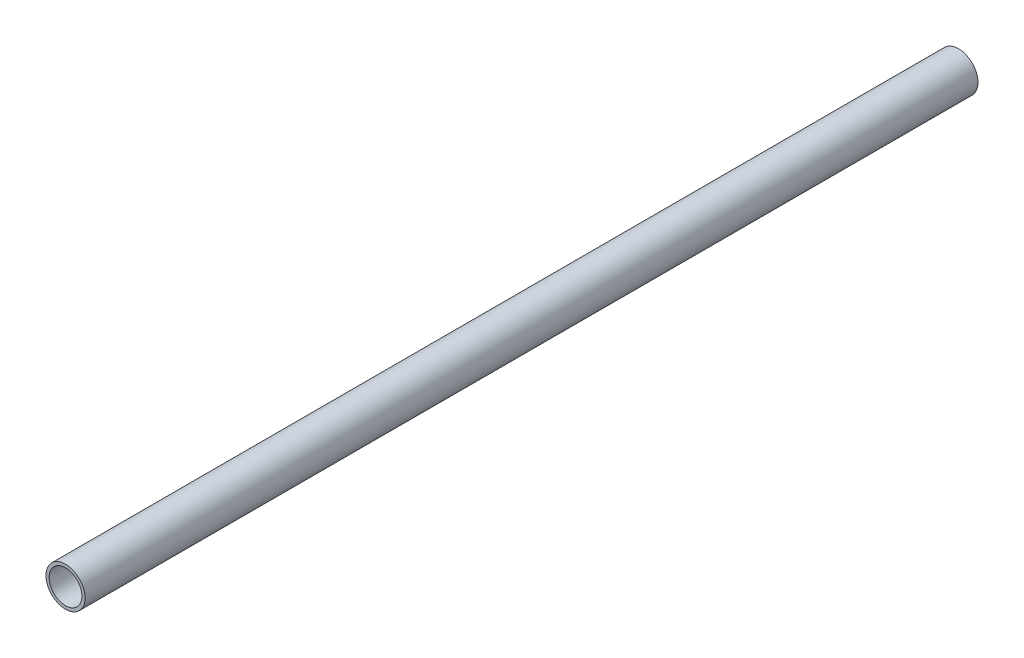
ISO-10303-21;
HEADER;
FILE_DESCRIPTION(('STEP AP214'),'2;1');
FILE_NAME('part.step','',(''),(''),'','','');
FILE_SCHEMA(('AUTOMOTIVE_DESIGN { 1 0 10303 214 1 1 1 1 }'));
ENDSEC;
DATA;
#1=APPLICATION_CONTEXT('core data for automotive mechanical design processes');
#2=APPLICATION_PROTOCOL_DEFINITION('international standard','automotive_design',2000,#1);
#3=PRODUCT_CONTEXT('',#1,'mechanical');
#4=PRODUCT('Part','Part','',(#3));
#5=PRODUCT_RELATED_PRODUCT_CATEGORY('part','',(#4));
#6=PRODUCT_DEFINITION_FORMATION('','',#4);
#7=PRODUCT_DEFINITION_CONTEXT('part definition',#1,'design');
#8=PRODUCT_DEFINITION('design','',#6,#7);
#9=PRODUCT_DEFINITION_SHAPE('','',#8);
#10=(LENGTH_UNIT() NAMED_UNIT(*) SI_UNIT(.MILLI.,.METRE.));
#11=(NAMED_UNIT(*) PLANE_ANGLE_UNIT() SI_UNIT($,.RADIAN.));
#12=(NAMED_UNIT(*) SI_UNIT($,.STERADIAN.) SOLID_ANGLE_UNIT());
#13=UNCERTAINTY_MEASURE_WITH_UNIT(LENGTH_MEASURE(1.E-05),#10,'distance_accuracy_value','');
#14=(GEOMETRIC_REPRESENTATION_CONTEXT(3) GLOBAL_UNCERTAINTY_ASSIGNED_CONTEXT((#13)) GLOBAL_UNIT_ASSIGNED_CONTEXT((#10,
#11,#12)) REPRESENTATION_CONTEXT('',''));
#15=CARTESIAN_POINT('',(0.,0.,0.));
#16=DIRECTION('',(0.,0.,1.));
#17=DIRECTION('',(1.,0.,0.));
#18=AXIS2_PLACEMENT_3D('',#15,#16,#17);
#19=CARTESIAN_POINT('',(0.,0.,571.));
#20=DIRECTION('',(0.,0.,1.));
#21=DIRECTION('',(1.,0.,0.));
#22=AXIS2_PLACEMENT_3D('',#19,#20,#21);
#23=PLANE('',#22);
#24=CARTESIAN_POINT('',(0.,0.,571.));
#25=DIRECTION('',(0.,0.,1.));
#26=DIRECTION('',(1.,0.,0.));
#27=AXIS2_PLACEMENT_3D('',#24,#25,#26);
#28=CIRCLE('',#27,12.5);
#29=CARTESIAN_POINT('',(12.5,0.,571.));
#30=VERTEX_POINT('',#29);
#31=EDGE_CURVE('E10',#30,#30,#28,.T.);
#32=ORIENTED_EDGE('',*,*,#31,.T.);
#33=EDGE_LOOP('',(#32));
#34=FACE_BOUND('',#33,.T.);
#35=CARTESIAN_POINT('',(0.,0.,571.));
#36=DIRECTION('',(0.,0.,1.));
#37=DIRECTION('',(1.,0.,0.));
#38=AXIS2_PLACEMENT_3D('',#35,#36,#37);
#39=CIRCLE('',#38,10.5);
#40=CARTESIAN_POINT('',(10.5,0.,571.));
#41=VERTEX_POINT('',#40);
#42=EDGE_CURVE('E42',#41,#41,#39,.T.);
#43=ORIENTED_EDGE('',*,*,#42,.F.);
#44=EDGE_LOOP('',(#43));
#45=FACE_BOUND('',#44,.T.);
#46=ADVANCED_FACE('F31',(#34,#45),#23,.T.);
#47=CARTESIAN_POINT('',(0.,0.,0.));
#48=DIRECTION('',(0.,0.,1.));
#49=DIRECTION('',(1.,0.,0.));
#50=AXIS2_PLACEMENT_3D('',#47,#48,#49);
#51=PLANE('',#50);
#52=CARTESIAN_POINT('',(0.,0.,0.));
#53=DIRECTION('',(0.,0.,1.));
#54=DIRECTION('',(1.,0.,0.));
#55=AXIS2_PLACEMENT_3D('',#52,#53,#54);
#56=CIRCLE('',#55,12.5);
#57=CARTESIAN_POINT('',(12.5,0.,0.));
#58=VERTEX_POINT('',#57);
#59=EDGE_CURVE('E35',#58,#58,#56,.T.);
#60=ORIENTED_EDGE('',*,*,#59,.F.);
#61=EDGE_LOOP('',(#60));
#62=FACE_BOUND('',#61,.T.);
#63=CARTESIAN_POINT('',(0.,0.,0.));
#64=DIRECTION('',(0.,0.,1.));
#65=DIRECTION('',(1.,0.,0.));
#66=AXIS2_PLACEMENT_3D('',#63,#64,#65);
#67=CIRCLE('',#66,10.5);
#68=CARTESIAN_POINT('',(10.5,0.,0.));
#69=VERTEX_POINT('',#68);
#70=EDGE_CURVE('E44',#69,#69,#67,.T.);
#71=ORIENTED_EDGE('',*,*,#70,.T.);
#72=EDGE_LOOP('',(#71));
#73=FACE_BOUND('',#72,.T.);
#74=ADVANCED_FACE('F54',(#62,#73),#51,.F.);
#75=CARTESIAN_POINT('',(0.,0.,571.));
#76=DIRECTION('',(0.,0.,-1.));
#77=DIRECTION('',(-1.,0.,0.));
#78=AXIS2_PLACEMENT_3D('',#75,#76,#77);
#79=CYLINDRICAL_SURFACE('',#78,12.5);
#80=ORIENTED_EDGE('',*,*,#31,.F.);
#81=EDGE_LOOP('',(#80));
#82=FACE_BOUND('',#81,.T.);
#83=ORIENTED_EDGE('',*,*,#59,.T.);
#84=EDGE_LOOP('',(#83));
#85=FACE_BOUND('',#84,.T.);
#86=ADVANCED_FACE('F33',(#82,#85),#79,.T.);
#87=CARTESIAN_POINT('',(0.,0.,571.));
#88=DIRECTION('',(0.,0.,-1.));
#89=DIRECTION('',(-1.,0.,0.));
#90=AXIS2_PLACEMENT_3D('',#87,#88,#89);
#91=CYLINDRICAL_SURFACE('',#90,10.5);
#92=ORIENTED_EDGE('',*,*,#42,.T.);
#93=EDGE_LOOP('',(#92));
#94=FACE_BOUND('',#93,.T.);
#95=ORIENTED_EDGE('',*,*,#70,.F.);
#96=EDGE_LOOP('',(#95));
#97=FACE_BOUND('',#96,.T.);
#98=ADVANCED_FACE('F50',(#94,#97),#91,.F.);
#99=CLOSED_SHELL('',(#46,#74,#86,#98));
#100=MANIFOLD_SOLID_BREP('B2',#99);
#101=ADVANCED_BREP_SHAPE_REPRESENTATION('',(#18,#100),#14);
#102=SHAPE_DEFINITION_REPRESENTATION(#9,#101);
ENDSEC;
END-ISO-10303-21;
